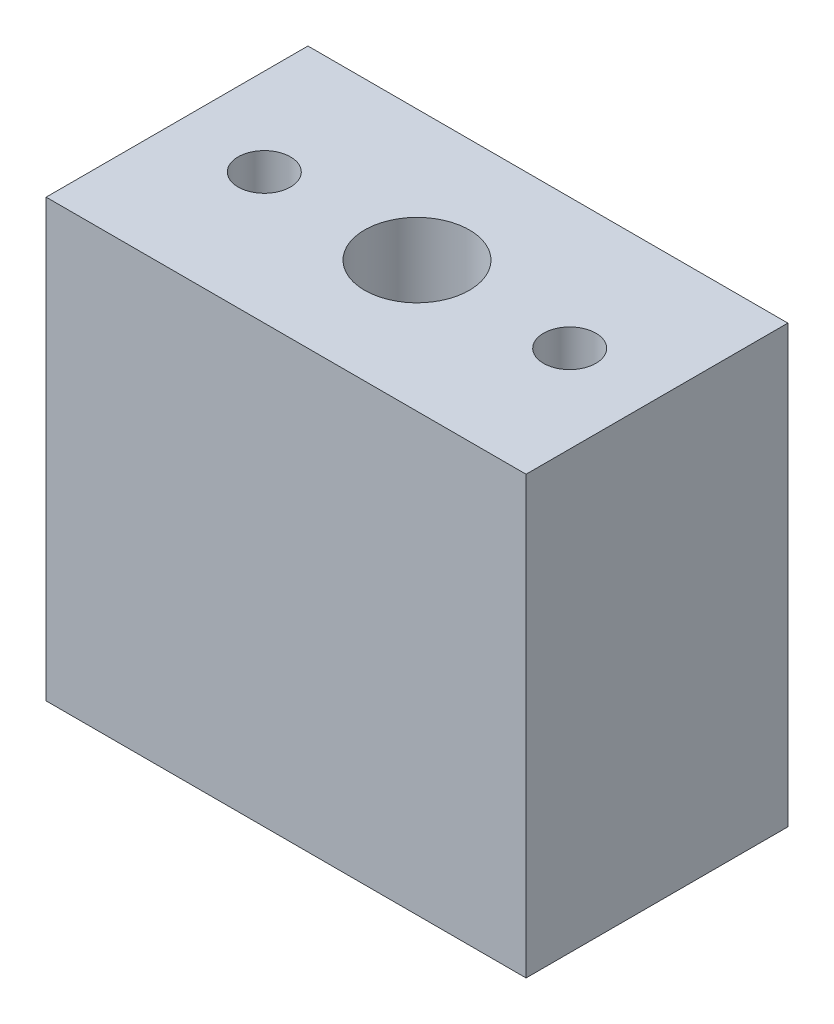
ISO-10303-21;
HEADER;
FILE_DESCRIPTION(('STEP AP214'),'2;1');
FILE_NAME('part.step','',(''),(''),'','','');
FILE_SCHEMA(('AUTOMOTIVE_DESIGN { 1 0 10303 214 1 1 1 1 }'));
ENDSEC;
DATA;
#1=APPLICATION_CONTEXT('core data for automotive mechanical design processes');
#2=APPLICATION_PROTOCOL_DEFINITION('international standard','automotive_design',2000,#1);
#3=PRODUCT_CONTEXT('',#1,'mechanical');
#4=PRODUCT('Part','Part','',(#3));
#5=PRODUCT_RELATED_PRODUCT_CATEGORY('part','',(#4));
#6=PRODUCT_DEFINITION_FORMATION('','',#4);
#7=PRODUCT_DEFINITION_CONTEXT('part definition',#1,'design');
#8=PRODUCT_DEFINITION('design','',#6,#7);
#9=PRODUCT_DEFINITION_SHAPE('','',#8);
#10=(LENGTH_UNIT() NAMED_UNIT(*) SI_UNIT(.MILLI.,.METRE.));
#11=(NAMED_UNIT(*) PLANE_ANGLE_UNIT() SI_UNIT($,.RADIAN.));
#12=(NAMED_UNIT(*) SI_UNIT($,.STERADIAN.) SOLID_ANGLE_UNIT());
#13=UNCERTAINTY_MEASURE_WITH_UNIT(LENGTH_MEASURE(1.E-05),#10,'distance_accuracy_value','');
#14=(GEOMETRIC_REPRESENTATION_CONTEXT(3) GLOBAL_UNCERTAINTY_ASSIGNED_CONTEXT((#13)) GLOBAL_UNIT_ASSIGNED_CONTEXT((#10,
#11,#12)) REPRESENTATION_CONTEXT('',''));
#15=CARTESIAN_POINT('',(0.,0.,0.));
#16=DIRECTION('',(0.,0.,1.));
#17=DIRECTION('',(1.,0.,0.));
#18=AXIS2_PLACEMENT_3D('',#15,#16,#17);
#19=CARTESIAN_POINT('',(0.,5.,-1.50000000000001));
#20=DIRECTION('',(0.,0.,1.));
#21=DIRECTION('',(1.,0.,0.));
#22=AXIS2_PLACEMENT_3D('',#19,#20,#21);
#23=PLANE('',#22);
#24=DIRECTION('',(-1.,0.,0.));
#25=VECTOR('',#24,1.);
#26=CARTESIAN_POINT('',(0.,0.,-1.50000000000001));
#27=LINE('',#26,#25);
#28=CARTESIAN_POINT('',(1.50000000000032,0.,-1.50000000000001));
#29=VERTEX_POINT('',#28);
#30=CARTESIAN_POINT('',(-3.99999999999968,0.,-1.50000000000001));
#31=VERTEX_POINT('',#30);
#32=EDGE_CURVE('E108',#29,#31,#27,.T.);
#33=ORIENTED_EDGE('',*,*,#32,.T.);
#34=DIRECTION('',(0.,-1.,0.));
#35=VECTOR('',#34,1.);
#36=CARTESIAN_POINT('',(-3.99999999999968,5.,-1.50000000000001));
#37=LINE('',#36,#35);
#38=CARTESIAN_POINT('',(-3.99999999999968,5.,-1.50000000000001));
#39=VERTEX_POINT('',#38);
#40=EDGE_CURVE('E11',#39,#31,#37,.T.);
#41=ORIENTED_EDGE('',*,*,#40,.F.);
#42=DIRECTION('',(-1.,0.,0.));
#43=VECTOR('',#42,1.);
#44=CARTESIAN_POINT('',(0.,5.,-1.50000000000001));
#45=LINE('',#44,#43);
#46=CARTESIAN_POINT('',(1.50000000000032,5.,-1.50000000000001));
#47=VERTEX_POINT('',#46);
#48=EDGE_CURVE('E85',#47,#39,#45,.T.);
#49=ORIENTED_EDGE('',*,*,#48,.F.);
#50=DIRECTION('',(0.,-1.,0.));
#51=VECTOR('',#50,1.);
#52=CARTESIAN_POINT('',(1.50000000000032,5.,-1.50000000000001));
#53=LINE('',#52,#51);
#54=EDGE_CURVE('E52',#47,#29,#53,.T.);
#55=ORIENTED_EDGE('',*,*,#54,.T.);
#56=EDGE_LOOP('',(#33,#41,#49,#55));
#57=FACE_BOUND('',#56,.T.);
#58=ADVANCED_FACE('F35',(#57),#23,.F.);
#59=CARTESIAN_POINT('',(-3.99999999999968,5.,0.));
#60=DIRECTION('',(1.,0.,0.));
#61=DIRECTION('',(0.,0.,-1.));
#62=AXIS2_PLACEMENT_3D('',#59,#60,#61);
#63=PLANE('',#62);
#64=DIRECTION('',(0.,0.,1.));
#65=VECTOR('',#64,1.);
#66=CARTESIAN_POINT('',(-3.99999999999968,0.,0.));
#67=LINE('',#66,#65);
#68=CARTESIAN_POINT('',(-3.99999999999968,0.,1.49999999999999));
#69=VERTEX_POINT('',#68);
#70=EDGE_CURVE('E90',#31,#69,#67,.T.);
#71=ORIENTED_EDGE('',*,*,#70,.T.);
#72=DIRECTION('',(0.,-1.,0.));
#73=VECTOR('',#72,1.);
#74=CARTESIAN_POINT('',(-3.99999999999968,5.,1.49999999999999));
#75=LINE('',#74,#73);
#76=CARTESIAN_POINT('',(-3.99999999999968,5.,1.49999999999999));
#77=VERTEX_POINT('',#76);
#78=EDGE_CURVE('E44',#77,#69,#75,.T.);
#79=ORIENTED_EDGE('',*,*,#78,.F.);
#80=DIRECTION('',(0.,0.,1.));
#81=VECTOR('',#80,1.);
#82=CARTESIAN_POINT('',(-3.99999999999968,5.,0.));
#83=LINE('',#82,#81);
#84=EDGE_CURVE('E77',#39,#77,#83,.T.);
#85=ORIENTED_EDGE('',*,*,#84,.F.);
#86=ORIENTED_EDGE('',*,*,#40,.T.);
#87=EDGE_LOOP('',(#71,#79,#85,#86));
#88=FACE_BOUND('',#87,.T.);
#89=ADVANCED_FACE('F89',(#88),#63,.F.);
#90=CARTESIAN_POINT('',(0.,5.,1.49999999999999));
#91=DIRECTION('',(0.,0.,1.));
#92=DIRECTION('',(1.,0.,0.));
#93=AXIS2_PLACEMENT_3D('',#90,#91,#92);
#94=PLANE('',#93);
#95=DIRECTION('',(-1.,0.,0.));
#96=VECTOR('',#95,1.);
#97=CARTESIAN_POINT('',(0.,0.,1.49999999999999));
#98=LINE('',#97,#96);
#99=CARTESIAN_POINT('',(1.50000000000032,0.,1.49999999999999));
#100=VERTEX_POINT('',#99);
#101=EDGE_CURVE('E111',#100,#69,#98,.T.);
#102=ORIENTED_EDGE('',*,*,#101,.F.);
#103=DIRECTION('',(0.,-1.,0.));
#104=VECTOR('',#103,1.);
#105=CARTESIAN_POINT('',(1.50000000000032,5.,1.49999999999999));
#106=LINE('',#105,#104);
#107=CARTESIAN_POINT('',(1.50000000000032,5.,1.49999999999999));
#108=VERTEX_POINT('',#107);
#109=EDGE_CURVE('E66',#108,#100,#106,.T.);
#110=ORIENTED_EDGE('',*,*,#109,.F.);
#111=DIRECTION('',(-1.,0.,0.));
#112=VECTOR('',#111,1.);
#113=CARTESIAN_POINT('',(0.,5.,1.49999999999999));
#114=LINE('',#113,#112);
#115=EDGE_CURVE('E84',#108,#77,#114,.T.);
#116=ORIENTED_EDGE('',*,*,#115,.T.);
#117=ORIENTED_EDGE('',*,*,#78,.T.);
#118=EDGE_LOOP('',(#102,#110,#116,#117));
#119=FACE_BOUND('',#118,.T.);
#120=ADVANCED_FACE('F93',(#119),#94,.T.);
#121=CARTESIAN_POINT('',(-1.24999999999968,5.,0.));
#122=DIRECTION('',(0.,-1.,0.));
#123=DIRECTION('',(0.,0.,-1.));
#124=AXIS2_PLACEMENT_3D('',#121,#122,#123);
#125=CYLINDRICAL_SURFACE('',#124,0.6);
#126=CARTESIAN_POINT('',(-1.24999999999968,5.,0.));
#127=DIRECTION('',(0.,1.,0.));
#128=DIRECTION('',(0.,0.,1.));
#129=AXIS2_PLACEMENT_3D('',#126,#127,#128);
#130=CIRCLE('',#129,0.6);
#131=CARTESIAN_POINT('',(-1.24999999999968,5.,0.599999999999994));
#132=VERTEX_POINT('',#131);
#133=EDGE_CURVE('E125',#132,#132,#130,.T.);
#134=ORIENTED_EDGE('',*,*,#133,.T.);
#135=EDGE_LOOP('',(#134));
#136=FACE_BOUND('',#135,.T.);
#137=CARTESIAN_POINT('',(-1.24999999999968,0.,0.));
#138=DIRECTION('',(0.,1.,0.));
#139=DIRECTION('',(0.,0.,1.));
#140=AXIS2_PLACEMENT_3D('',#137,#138,#139);
#141=CIRCLE('',#140,0.6);
#142=CARTESIAN_POINT('',(-1.24999999999968,0.,0.599999999999994));
#143=VERTEX_POINT('',#142);
#144=EDGE_CURVE('E105',#143,#143,#141,.T.);
#145=ORIENTED_EDGE('',*,*,#144,.F.);
#146=EDGE_LOOP('',(#145));
#147=FACE_BOUND('',#146,.T.);
#148=ADVANCED_FACE('F131',(#136,#147),#125,.F.);
#149=CARTESIAN_POINT('',(-3.,5.,0.));
#150=DIRECTION('',(0.,-1.,0.));
#151=DIRECTION('',(0.,0.,-1.));
#152=AXIS2_PLACEMENT_3D('',#149,#150,#151);
#153=CYLINDRICAL_SURFACE('',#152,0.3);
#154=CARTESIAN_POINT('',(-3.,5.,0.));
#155=DIRECTION('',(0.,1.,0.));
#156=DIRECTION('',(0.,0.,1.));
#157=AXIS2_PLACEMENT_3D('',#154,#155,#156);
#158=CIRCLE('',#157,0.3);
#159=CARTESIAN_POINT('',(-3.,5.,0.3));
#160=VERTEX_POINT('',#159);
#161=EDGE_CURVE('E120',#160,#160,#158,.T.);
#162=ORIENTED_EDGE('',*,*,#161,.T.);
#163=EDGE_LOOP('',(#162));
#164=FACE_BOUND('',#163,.T.);
#165=CARTESIAN_POINT('',(-3.,0.,0.));
#166=DIRECTION('',(0.,1.,0.));
#167=DIRECTION('',(0.,0.,1.));
#168=AXIS2_PLACEMENT_3D('',#165,#166,#167);
#169=CIRCLE('',#168,0.3);
#170=CARTESIAN_POINT('',(-3.,0.,0.3));
#171=VERTEX_POINT('',#170);
#172=EDGE_CURVE('E102',#171,#171,#169,.T.);
#173=ORIENTED_EDGE('',*,*,#172,.F.);
#174=EDGE_LOOP('',(#173));
#175=FACE_BOUND('',#174,.T.);
#176=ADVANCED_FACE('F156',(#164,#175),#153,.F.);
#177=CARTESIAN_POINT('',(0.5,5.,0.));
#178=DIRECTION('',(0.,-1.,0.));
#179=DIRECTION('',(0.,0.,-1.));
#180=AXIS2_PLACEMENT_3D('',#177,#178,#179);
#181=CYLINDRICAL_SURFACE('',#180,0.3);
#182=CARTESIAN_POINT('',(0.5,5.,0.));
#183=DIRECTION('',(0.,1.,0.));
#184=DIRECTION('',(0.,0.,1.));
#185=AXIS2_PLACEMENT_3D('',#182,#183,#184);
#186=CIRCLE('',#185,0.3);
#187=CARTESIAN_POINT('',(0.5,5.,0.3));
#188=VERTEX_POINT('',#187);
#189=EDGE_CURVE('E116',#188,#188,#186,.T.);
#190=ORIENTED_EDGE('',*,*,#189,.T.);
#191=EDGE_LOOP('',(#190));
#192=FACE_BOUND('',#191,.T.);
#193=CARTESIAN_POINT('',(0.5,0.,0.));
#194=DIRECTION('',(0.,1.,0.));
#195=DIRECTION('',(0.,0.,1.));
#196=AXIS2_PLACEMENT_3D('',#193,#194,#195);
#197=CIRCLE('',#196,0.3);
#198=CARTESIAN_POINT('',(0.5,0.,0.3));
#199=VERTEX_POINT('',#198);
#200=EDGE_CURVE('E99',#199,#199,#197,.T.);
#201=ORIENTED_EDGE('',*,*,#200,.F.);
#202=EDGE_LOOP('',(#201));
#203=FACE_BOUND('',#202,.T.);
#204=ADVANCED_FACE('F37',(#192,#203),#181,.F.);
#205=CARTESIAN_POINT('',(1.50000000000032,5.,0.));
#206=DIRECTION('',(1.,0.,0.));
#207=DIRECTION('',(0.,0.,-1.));
#208=AXIS2_PLACEMENT_3D('',#205,#206,#207);
#209=PLANE('',#208);
#210=DIRECTION('',(0.,0.,1.));
#211=VECTOR('',#210,1.);
#212=CARTESIAN_POINT('',(1.50000000000032,0.,0.));
#213=LINE('',#212,#211);
#214=EDGE_CURVE('E113',#29,#100,#213,.T.);
#215=ORIENTED_EDGE('',*,*,#214,.F.);
#216=ORIENTED_EDGE('',*,*,#54,.F.);
#217=DIRECTION('',(0.,0.,1.));
#218=VECTOR('',#217,1.);
#219=CARTESIAN_POINT('',(1.50000000000032,5.,0.));
#220=LINE('',#219,#218);
#221=EDGE_CURVE('E94',#47,#108,#220,.T.);
#222=ORIENTED_EDGE('',*,*,#221,.T.);
#223=ORIENTED_EDGE('',*,*,#109,.T.);
#224=EDGE_LOOP('',(#215,#216,#222,#223));
#225=FACE_BOUND('',#224,.T.);
#226=ADVANCED_FACE('F136',(#225),#209,.T.);
#227=CARTESIAN_POINT('',(0.,5.,0.));
#228=DIRECTION('',(0.,1.,0.));
#229=DIRECTION('',(0.,0.,1.));
#230=AXIS2_PLACEMENT_3D('',#227,#228,#229);
#231=PLANE('',#230);
#232=ORIENTED_EDGE('',*,*,#189,.F.);
#233=EDGE_LOOP('',(#232));
#234=FACE_BOUND('',#233,.T.);
#235=ORIENTED_EDGE('',*,*,#161,.F.);
#236=EDGE_LOOP('',(#235));
#237=FACE_BOUND('',#236,.T.);
#238=ORIENTED_EDGE('',*,*,#133,.F.);
#239=EDGE_LOOP('',(#238));
#240=FACE_BOUND('',#239,.T.);
#241=ORIENTED_EDGE('',*,*,#48,.T.);
#242=ORIENTED_EDGE('',*,*,#84,.T.);
#243=ORIENTED_EDGE('',*,*,#115,.F.);
#244=ORIENTED_EDGE('',*,*,#221,.F.);
#245=EDGE_LOOP('',(#241,#242,#243,#244));
#246=FACE_BOUND('',#245,.T.);
#247=ADVANCED_FACE('F81',(#234,#237,#240,#246),#231,.T.);
#248=CARTESIAN_POINT('',(0.,0.,0.));
#249=DIRECTION('',(0.,1.,0.));
#250=DIRECTION('',(0.,0.,1.));
#251=AXIS2_PLACEMENT_3D('',#248,#249,#250);
#252=PLANE('',#251);
#253=ORIENTED_EDGE('',*,*,#200,.T.);
#254=EDGE_LOOP('',(#253));
#255=FACE_BOUND('',#254,.T.);
#256=ORIENTED_EDGE('',*,*,#172,.T.);
#257=EDGE_LOOP('',(#256));
#258=FACE_BOUND('',#257,.T.);
#259=ORIENTED_EDGE('',*,*,#144,.T.);
#260=EDGE_LOOP('',(#259));
#261=FACE_BOUND('',#260,.T.);
#262=ORIENTED_EDGE('',*,*,#32,.F.);
#263=ORIENTED_EDGE('',*,*,#214,.T.);
#264=ORIENTED_EDGE('',*,*,#101,.T.);
#265=ORIENTED_EDGE('',*,*,#70,.F.);
#266=EDGE_LOOP('',(#262,#263,#264,#265));
#267=FACE_BOUND('',#266,.T.);
#268=ADVANCED_FACE('F135',(#255,#258,#261,#267),#252,.F.);
#269=CLOSED_SHELL('',(#58,#89,#120,#148,#176,#204,#226,#247,#268));
#270=MANIFOLD_SOLID_BREP('B2',#269);
#271=ADVANCED_BREP_SHAPE_REPRESENTATION('',(#18,#270),#14);
#272=SHAPE_DEFINITION_REPRESENTATION(#9,#271);
ENDSEC;
END-ISO-10303-21;
